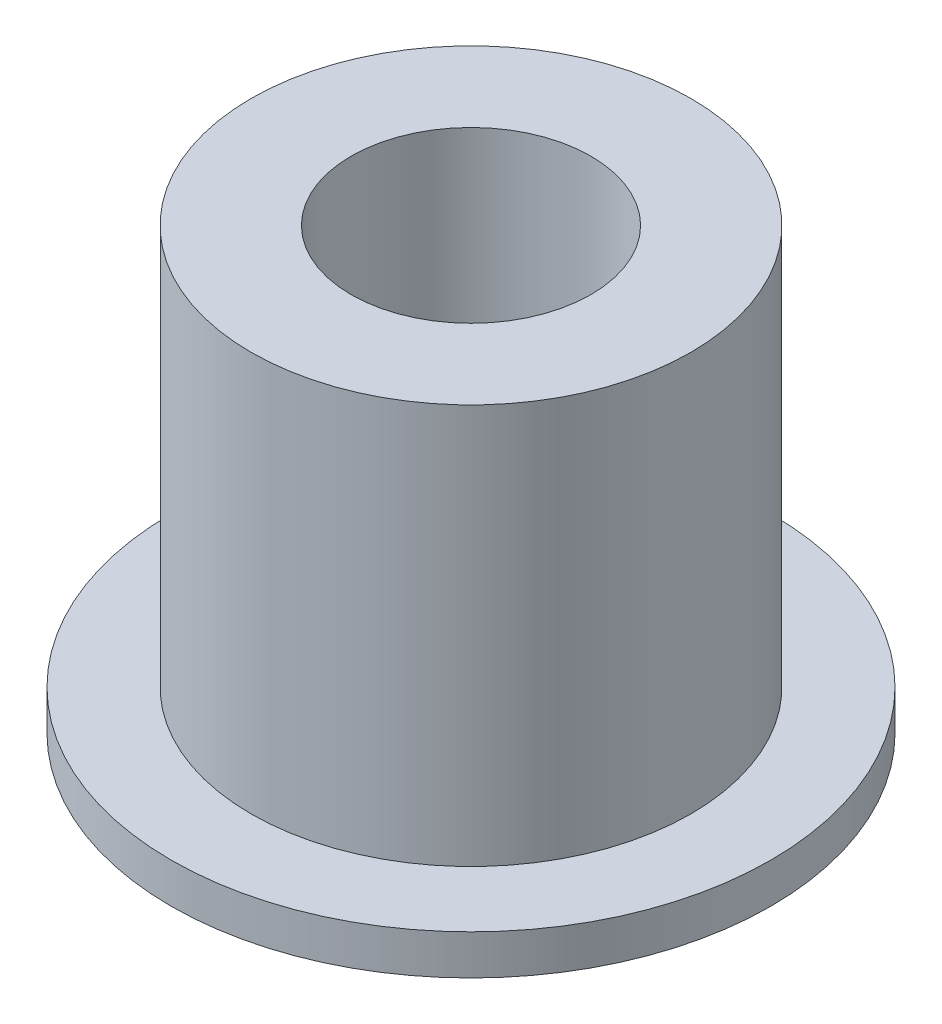
ISO-10303-21;
HEADER;
FILE_DESCRIPTION(('STEP AP214'),'2;1');
FILE_NAME('part.step','',(''),(''),'','','');
FILE_SCHEMA(('AUTOMOTIVE_DESIGN { 1 0 10303 214 1 1 1 1 }'));
ENDSEC;
DATA;
#1=APPLICATION_CONTEXT('core data for automotive mechanical design processes');
#2=APPLICATION_PROTOCOL_DEFINITION('international standard','automotive_design',2000,#1);
#3=PRODUCT_CONTEXT('',#1,'mechanical');
#4=PRODUCT('Part','Part','',(#3));
#5=PRODUCT_RELATED_PRODUCT_CATEGORY('part','',(#4));
#6=PRODUCT_DEFINITION_FORMATION('','',#4);
#7=PRODUCT_DEFINITION_CONTEXT('part definition',#1,'design');
#8=PRODUCT_DEFINITION('design','',#6,#7);
#9=PRODUCT_DEFINITION_SHAPE('','',#8);
#10=(LENGTH_UNIT() NAMED_UNIT(*) SI_UNIT(.MILLI.,.METRE.));
#11=(NAMED_UNIT(*) PLANE_ANGLE_UNIT() SI_UNIT($,.RADIAN.));
#12=(NAMED_UNIT(*) SI_UNIT($,.STERADIAN.) SOLID_ANGLE_UNIT());
#13=UNCERTAINTY_MEASURE_WITH_UNIT(LENGTH_MEASURE(1.E-05),#10,'distance_accuracy_value','');
#14=(GEOMETRIC_REPRESENTATION_CONTEXT(3) GLOBAL_UNCERTAINTY_ASSIGNED_CONTEXT((#13)) GLOBAL_UNIT_ASSIGNED_CONTEXT((#10,
#11,#12)) REPRESENTATION_CONTEXT('',''));
#15=CARTESIAN_POINT('',(0.,0.,0.));
#16=DIRECTION('',(0.,0.,1.));
#17=DIRECTION('',(1.,0.,0.));
#18=AXIS2_PLACEMENT_3D('',#15,#16,#17);
#19=CARTESIAN_POINT('',(0.,5.5,0.));
#20=DIRECTION('',(0.,-1.,0.));
#21=DIRECTION('',(0.,0.,-1.));
#22=AXIS2_PLACEMENT_3D('',#19,#20,#21);
#23=CYLINDRICAL_SURFACE('',#22,5.5);
#24=CARTESIAN_POINT('',(0.,5.5,0.));
#25=DIRECTION('',(0.,1.,0.));
#26=DIRECTION('',(0.,0.,1.));
#27=AXIS2_PLACEMENT_3D('',#24,#25,#26);
#28=CIRCLE('',#27,5.5);
#29=CARTESIAN_POINT('',(0.,5.5,5.5));
#30=VERTEX_POINT('',#29);
#31=EDGE_CURVE('E42',#30,#30,#28,.T.);
#32=ORIENTED_EDGE('',*,*,#31,.F.);
#33=EDGE_LOOP('',(#32));
#34=FACE_BOUND('',#33,.T.);
#35=CARTESIAN_POINT('',(0.,-4.5,0.));
#36=DIRECTION('',(0.,-1.,0.));
#37=DIRECTION('',(0.,0.,-1.));
#38=AXIS2_PLACEMENT_3D('',#35,#36,#37);
#39=CIRCLE('',#38,5.5);
#40=CARTESIAN_POINT('',(0.,-4.5,-5.5));
#41=VERTEX_POINT('',#40);
#42=EDGE_CURVE('E10',#41,#41,#39,.T.);
#43=ORIENTED_EDGE('',*,*,#42,.F.);
#44=EDGE_LOOP('',(#43));
#45=FACE_BOUND('',#44,.T.);
#46=ADVANCED_FACE('F36',(#34,#45),#23,.T.);
#47=CARTESIAN_POINT('',(0.,5.5,0.));
#48=DIRECTION('',(0.,1.,0.));
#49=DIRECTION('',(0.,0.,1.));
#50=AXIS2_PLACEMENT_3D('',#47,#48,#49);
#51=PLANE('',#50);
#52=CARTESIAN_POINT('',(0.,5.5,0.));
#53=DIRECTION('',(0.,1.,0.));
#54=DIRECTION('',(0.,0.,1.));
#55=AXIS2_PLACEMENT_3D('',#52,#53,#54);
#56=CIRCLE('',#55,3.);
#57=CARTESIAN_POINT('',(0.,5.5,3.));
#58=VERTEX_POINT('',#57);
#59=EDGE_CURVE('E56',#58,#58,#56,.T.);
#60=ORIENTED_EDGE('',*,*,#59,.F.);
#61=EDGE_LOOP('',(#60));
#62=FACE_BOUND('',#61,.T.);
#63=ORIENTED_EDGE('',*,*,#31,.T.);
#64=EDGE_LOOP('',(#63));
#65=FACE_BOUND('',#64,.T.);
#66=ADVANCED_FACE('F71',(#62,#65),#51,.T.);
#67=CARTESIAN_POINT('',(0.,-4.5,0.));
#68=DIRECTION('',(0.,-1.,0.));
#69=DIRECTION('',(0.,0.,-1.));
#70=AXIS2_PLACEMENT_3D('',#67,#68,#69);
#71=CYLINDRICAL_SURFACE('',#70,7.5);
#72=CARTESIAN_POINT('',(0.,-4.5,0.));
#73=DIRECTION('',(0.,-1.,0.));
#74=DIRECTION('',(0.,0.,-1.));
#75=AXIS2_PLACEMENT_3D('',#72,#73,#74);
#76=CIRCLE('',#75,7.5);
#77=CARTESIAN_POINT('',(0.,-4.5,-7.5));
#78=VERTEX_POINT('',#77);
#79=EDGE_CURVE('E46',#78,#78,#76,.T.);
#80=ORIENTED_EDGE('',*,*,#79,.T.);
#81=EDGE_LOOP('',(#80));
#82=FACE_BOUND('',#81,.T.);
#83=CARTESIAN_POINT('',(0.,-5.5,0.));
#84=DIRECTION('',(0.,-1.,0.));
#85=DIRECTION('',(0.,0.,-1.));
#86=AXIS2_PLACEMENT_3D('',#83,#84,#85);
#87=CIRCLE('',#86,7.5);
#88=CARTESIAN_POINT('',(0.,-5.5,-7.5));
#89=VERTEX_POINT('',#88);
#90=EDGE_CURVE('E50',#89,#89,#87,.T.);
#91=ORIENTED_EDGE('',*,*,#90,.F.);
#92=EDGE_LOOP('',(#91));
#93=FACE_BOUND('',#92,.T.);
#94=ADVANCED_FACE('F73',(#82,#93),#71,.T.);
#95=CARTESIAN_POINT('',(0.,-4.5,0.));
#96=DIRECTION('',(0.,-1.,0.));
#97=DIRECTION('',(0.,0.,-1.));
#98=AXIS2_PLACEMENT_3D('',#95,#96,#97);
#99=PLANE('',#98);
#100=ORIENTED_EDGE('',*,*,#42,.T.);
#101=EDGE_LOOP('',(#100));
#102=FACE_BOUND('',#101,.T.);
#103=ORIENTED_EDGE('',*,*,#79,.F.);
#104=EDGE_LOOP('',(#103));
#105=FACE_BOUND('',#104,.T.);
#106=ADVANCED_FACE('F79',(#102,#105),#99,.F.);
#107=CARTESIAN_POINT('',(0.,-5.5,0.));
#108=DIRECTION('',(0.,1.,0.));
#109=DIRECTION('',(0.,0.,1.));
#110=AXIS2_PLACEMENT_3D('',#107,#108,#109);
#111=PLANE('',#110);
#112=CARTESIAN_POINT('',(0.,-5.5,0.));
#113=DIRECTION('',(0.,1.,0.));
#114=DIRECTION('',(0.,0.,1.));
#115=AXIS2_PLACEMENT_3D('',#112,#113,#114);
#116=CIRCLE('',#115,3.);
#117=CARTESIAN_POINT('',(0.,-5.5,3.));
#118=VERTEX_POINT('',#117);
#119=EDGE_CURVE('E54',#118,#118,#116,.T.);
#120=ORIENTED_EDGE('',*,*,#119,.T.);
#121=EDGE_LOOP('',(#120));
#122=FACE_BOUND('',#121,.T.);
#123=ORIENTED_EDGE('',*,*,#90,.T.);
#124=EDGE_LOOP('',(#123));
#125=FACE_BOUND('',#124,.T.);
#126=ADVANCED_FACE('F62',(#122,#125),#111,.F.);
#127=CARTESIAN_POINT('',(0.,-5.5,0.));
#128=DIRECTION('',(0.,1.,0.));
#129=DIRECTION('',(0.,0.,1.));
#130=AXIS2_PLACEMENT_3D('',#127,#128,#129);
#131=CYLINDRICAL_SURFACE('',#130,3.);
#132=ORIENTED_EDGE('',*,*,#119,.F.);
#133=EDGE_LOOP('',(#132));
#134=FACE_BOUND('',#133,.T.);
#135=ORIENTED_EDGE('',*,*,#59,.T.);
#136=EDGE_LOOP('',(#135));
#137=FACE_BOUND('',#136,.T.);
#138=ADVANCED_FACE('F65',(#134,#137),#131,.F.);
#139=CLOSED_SHELL('',(#46,#66,#94,#106,#126,#138));
#140=MANIFOLD_SOLID_BREP('B2',#139);
#141=ADVANCED_BREP_SHAPE_REPRESENTATION('',(#18,#140),#14);
#142=SHAPE_DEFINITION_REPRESENTATION(#9,#141);
ENDSEC;
END-ISO-10303-21;
